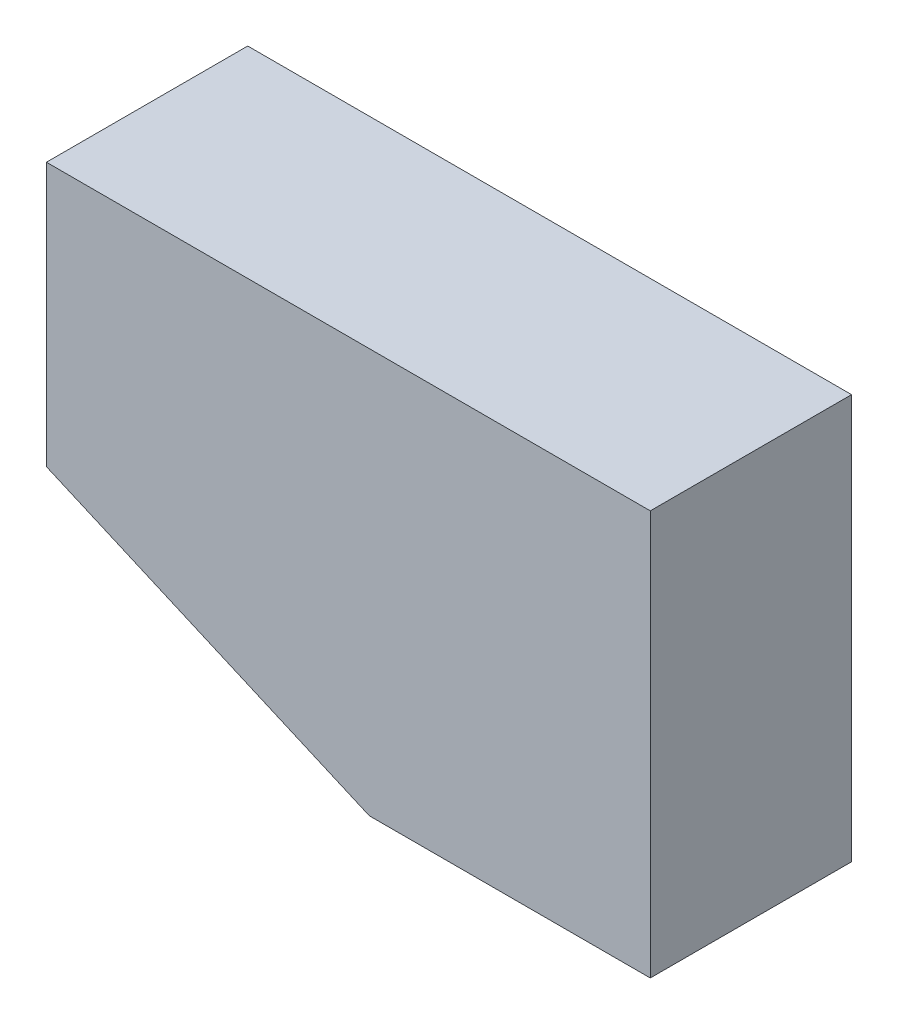
ISO-10303-21;
HEADER;
FILE_DESCRIPTION(('STEP AP214'),'2;1');
FILE_NAME('part.step','',(''),(''),'','','');
FILE_SCHEMA(('AUTOMOTIVE_DESIGN { 1 0 10303 214 1 1 1 1 }'));
ENDSEC;
DATA;
#1=APPLICATION_CONTEXT('core data for automotive mechanical design processes');
#2=APPLICATION_PROTOCOL_DEFINITION('international standard','automotive_design',2000,#1);
#3=PRODUCT_CONTEXT('',#1,'mechanical');
#4=PRODUCT('Part','Part','',(#3));
#5=PRODUCT_RELATED_PRODUCT_CATEGORY('part','',(#4));
#6=PRODUCT_DEFINITION_FORMATION('','',#4);
#7=PRODUCT_DEFINITION_CONTEXT('part definition',#1,'design');
#8=PRODUCT_DEFINITION('design','',#6,#7);
#9=PRODUCT_DEFINITION_SHAPE('','',#8);
#10=(LENGTH_UNIT() NAMED_UNIT(*) SI_UNIT(.MILLI.,.METRE.));
#11=(NAMED_UNIT(*) PLANE_ANGLE_UNIT() SI_UNIT($,.RADIAN.));
#12=(NAMED_UNIT(*) SI_UNIT($,.STERADIAN.) SOLID_ANGLE_UNIT());
#13=UNCERTAINTY_MEASURE_WITH_UNIT(LENGTH_MEASURE(1.E-05),#10,'distance_accuracy_value','');
#14=(GEOMETRIC_REPRESENTATION_CONTEXT(3) GLOBAL_UNCERTAINTY_ASSIGNED_CONTEXT((#13)) GLOBAL_UNIT_ASSIGNED_CONTEXT((#10,
#11,#12)) REPRESENTATION_CONTEXT('',''));
#15=CARTESIAN_POINT('',(0.,0.,0.));
#16=DIRECTION('',(0.,0.,1.));
#17=DIRECTION('',(1.,0.,0.));
#18=AXIS2_PLACEMENT_3D('',#15,#16,#17);
#19=CARTESIAN_POINT('',(9.15303283249891,193.333333333333,200.));
#20=DIRECTION('',(1.,0.,0.));
#21=DIRECTION('',(0.,1.,0.));
#22=AXIS2_PLACEMENT_3D('',#19,#20,#21);
#23=PLANE('',#22);
#24=DIRECTION('',(0.,-1.,0.));
#25=VECTOR('',#24,1.);
#26=CARTESIAN_POINT('',(9.15303283249891,193.333333333333,0.));
#27=LINE('',#26,#25);
#28=CARTESIAN_POINT('',(9.15303283249891,195.333333333333,0.));
#29=VERTEX_POINT('',#28);
#30=CARTESIAN_POINT('',(9.15303283249894,-66.6666666666667,0.));
#31=VERTEX_POINT('',#30);
#32=EDGE_CURVE('E150',#29,#31,#27,.T.);
#33=ORIENTED_EDGE('',*,*,#32,.T.);
#34=DIRECTION('',(0.,0.,-1.));
#35=VECTOR('',#34,1.);
#36=CARTESIAN_POINT('',(9.15303283249894,-66.6666666666667,200.));
#37=LINE('',#36,#35);
#38=CARTESIAN_POINT('',(9.15303283249894,-66.6666666666667,200.));
#39=VERTEX_POINT('',#38);
#40=EDGE_CURVE('E11',#39,#31,#37,.T.);
#41=ORIENTED_EDGE('',*,*,#40,.F.);
#42=DIRECTION('',(0.,-1.,0.));
#43=VECTOR('',#42,1.);
#44=CARTESIAN_POINT('',(9.15303283249891,193.333333333333,200.));
#45=LINE('',#44,#43);
#46=CARTESIAN_POINT('',(9.15303283249891,195.333333333333,200.));
#47=VERTEX_POINT('',#46);
#48=EDGE_CURVE('E118',#47,#39,#45,.T.);
#49=ORIENTED_EDGE('',*,*,#48,.F.);
#50=DIRECTION('',(0.,0.,1.));
#51=VECTOR('',#50,1.);
#52=CARTESIAN_POINT('',(9.15303283249891,195.333333333333,0.));
#53=LINE('',#52,#51);
#54=EDGE_CURVE('E122',#29,#47,#53,.T.);
#55=ORIENTED_EDGE('',*,*,#54,.F.);
#56=EDGE_LOOP('',(#33,#41,#49,#55));
#57=FACE_BOUND('',#56,.T.);
#58=ADVANCED_FACE('F35',(#57),#23,.F.);
#59=CARTESIAN_POINT('',(9.15303283249894,-66.6666666666667,200.));
#60=DIRECTION('',(0.4,0.916515138991168,0.));
#61=DIRECTION('',(-0.916515138991168,0.4,0.));
#62=AXIS2_PLACEMENT_3D('',#59,#60,#61);
#63=PLANE('',#62);
#64=DIRECTION('',(0.916515138991168,-0.4,0.));
#65=VECTOR('',#64,1.);
#66=CARTESIAN_POINT('',(9.15303283249894,-66.6666666666667,0.));
#67=LINE('',#66,#65);
#68=CARTESIAN_POINT('',(329.933331479408,-206.666666666667,0.));
#69=VERTEX_POINT('',#68);
#70=EDGE_CURVE('E65',#31,#69,#67,.T.);
#71=ORIENTED_EDGE('',*,*,#70,.T.);
#72=DIRECTION('',(0.,0.,-1.));
#73=VECTOR('',#72,1.);
#74=CARTESIAN_POINT('',(329.933331479408,-206.666666666667,200.));
#75=LINE('',#74,#73);
#76=CARTESIAN_POINT('',(329.933331479408,-206.666666666667,200.));
#77=VERTEX_POINT('',#76);
#78=EDGE_CURVE('E44',#77,#69,#75,.T.);
#79=ORIENTED_EDGE('',*,*,#78,.F.);
#80=DIRECTION('',(0.916515138991168,-0.4,0.));
#81=VECTOR('',#80,1.);
#82=CARTESIAN_POINT('',(9.15303283249894,-66.6666666666667,200.));
#83=LINE('',#82,#81);
#84=EDGE_CURVE('E73',#39,#77,#83,.T.);
#85=ORIENTED_EDGE('',*,*,#84,.F.);
#86=ORIENTED_EDGE('',*,*,#40,.T.);
#87=EDGE_LOOP('',(#71,#79,#85,#86));
#88=FACE_BOUND('',#87,.T.);
#89=ADVANCED_FACE('F204',(#88),#63,.F.);
#90=CARTESIAN_POINT('',(329.933331479408,-206.666666666667,200.));
#91=DIRECTION('',(0.,1.,0.));
#92=DIRECTION('',(0.,0.,1.));
#93=AXIS2_PLACEMENT_3D('',#90,#91,#92);
#94=PLANE('',#93);
#95=DIRECTION('',(1.,0.,0.));
#96=VECTOR('',#95,1.);
#97=CARTESIAN_POINT('',(329.933331479408,-206.666666666667,0.));
#98=LINE('',#97,#96);
#99=CARTESIAN_POINT('',(609.153032832499,-206.666666666667,0.));
#100=VERTEX_POINT('',#99);
#101=EDGE_CURVE('E70',#69,#100,#98,.T.);
#102=ORIENTED_EDGE('',*,*,#101,.T.);
#103=DIRECTION('',(0.,0.,-1.));
#104=VECTOR('',#103,1.);
#105=CARTESIAN_POINT('',(609.153032832499,-206.666666666667,200.));
#106=LINE('',#105,#104);
#107=CARTESIAN_POINT('',(609.153032832499,-206.666666666667,200.));
#108=VERTEX_POINT('',#107);
#109=EDGE_CURVE('E186',#108,#100,#106,.T.);
#110=ORIENTED_EDGE('',*,*,#109,.F.);
#111=DIRECTION('',(1.,0.,0.));
#112=VECTOR('',#111,1.);
#113=CARTESIAN_POINT('',(329.933331479408,-206.666666666667,200.));
#114=LINE('',#113,#112);
#115=EDGE_CURVE('E52',#77,#108,#114,.T.);
#116=ORIENTED_EDGE('',*,*,#115,.F.);
#117=ORIENTED_EDGE('',*,*,#78,.T.);
#118=EDGE_LOOP('',(#102,#110,#116,#117));
#119=FACE_BOUND('',#118,.T.);
#120=ADVANCED_FACE('F191',(#119),#94,.F.);
#121=CARTESIAN_POINT('',(609.153032832499,193.333333333333,200.));
#122=DIRECTION('',(-1.,0.,0.));
#123=DIRECTION('',(0.,0.,1.));
#124=AXIS2_PLACEMENT_3D('',#121,#122,#123);
#125=PLANE('',#124);
#126=DIRECTION('',(0.,1.,0.));
#127=VECTOR('',#126,1.);
#128=CARTESIAN_POINT('',(609.153032832499,193.333333333333,0.));
#129=LINE('',#128,#127);
#130=CARTESIAN_POINT('',(609.153032832499,195.333333333333,0.));
#131=VERTEX_POINT('',#130);
#132=EDGE_CURVE('E123',#100,#131,#129,.T.);
#133=ORIENTED_EDGE('',*,*,#132,.T.);
#134=DIRECTION('',(0.,0.,-1.));
#135=VECTOR('',#134,1.);
#136=CARTESIAN_POINT('',(609.153032832499,195.333333333333,0.));
#137=LINE('',#136,#135);
#138=CARTESIAN_POINT('',(609.153032832499,195.333333333333,200.));
#139=VERTEX_POINT('',#138);
#140=EDGE_CURVE('E133',#139,#131,#137,.T.);
#141=ORIENTED_EDGE('',*,*,#140,.F.);
#142=DIRECTION('',(0.,1.,0.));
#143=VECTOR('',#142,1.);
#144=CARTESIAN_POINT('',(609.153032832499,193.333333333333,200.));
#145=LINE('',#144,#143);
#146=EDGE_CURVE('E129',#108,#139,#145,.T.);
#147=ORIENTED_EDGE('',*,*,#146,.F.);
#148=ORIENTED_EDGE('',*,*,#109,.T.);
#149=EDGE_LOOP('',(#133,#141,#147,#148));
#150=FACE_BOUND('',#149,.T.);
#151=ADVANCED_FACE('F196',(#150),#125,.F.);
#152=CARTESIAN_POINT('',(0.,0.,200.));
#153=DIRECTION('',(0.,0.,1.));
#154=DIRECTION('',(1.,0.,0.));
#155=AXIS2_PLACEMENT_3D('',#152,#153,#154);
#156=PLANE('',#155);
#157=ORIENTED_EDGE('',*,*,#48,.T.);
#158=ORIENTED_EDGE('',*,*,#84,.T.);
#159=ORIENTED_EDGE('',*,*,#115,.T.);
#160=ORIENTED_EDGE('',*,*,#146,.T.);
#161=DIRECTION('',(1.,0.,0.));
#162=VECTOR('',#161,1.);
#163=CARTESIAN_POINT('',(9.15303283249891,195.333333333333,200.));
#164=LINE('',#163,#162);
#165=EDGE_CURVE('E126',#47,#139,#164,.T.);
#166=ORIENTED_EDGE('',*,*,#165,.F.);
#167=EDGE_LOOP('',(#157,#158,#159,#160,#166));
#168=FACE_BOUND('',#167,.T.);
#169=ADVANCED_FACE('F127',(#168),#156,.T.);
#170=CARTESIAN_POINT('',(0.,0.,0.));
#171=DIRECTION('',(0.,0.,1.));
#172=DIRECTION('',(1.,0.,0.));
#173=AXIS2_PLACEMENT_3D('',#170,#171,#172);
#174=PLANE('',#173);
#175=ORIENTED_EDGE('',*,*,#32,.F.);
#176=DIRECTION('',(-1.,0.,0.));
#177=VECTOR('',#176,1.);
#178=CARTESIAN_POINT('',(9.15303283249891,195.333333333333,0.));
#179=LINE('',#178,#177);
#180=EDGE_CURVE('E138',#131,#29,#179,.T.);
#181=ORIENTED_EDGE('',*,*,#180,.F.);
#182=ORIENTED_EDGE('',*,*,#132,.F.);
#183=ORIENTED_EDGE('',*,*,#101,.F.);
#184=ORIENTED_EDGE('',*,*,#70,.F.);
#185=EDGE_LOOP('',(#175,#181,#182,#183,#184));
#186=FACE_BOUND('',#185,.T.);
#187=ADVANCED_FACE('F194',(#186),#174,.F.);
#188=CARTESIAN_POINT('',(0.,195.333333333333,0.));
#189=DIRECTION('',(0.,1.,0.));
#190=DIRECTION('',(0.,0.,1.));
#191=AXIS2_PLACEMENT_3D('',#188,#189,#190);
#192=PLANE('',#191);
#193=ORIENTED_EDGE('',*,*,#54,.T.);
#194=ORIENTED_EDGE('',*,*,#165,.T.);
#195=ORIENTED_EDGE('',*,*,#140,.T.);
#196=ORIENTED_EDGE('',*,*,#180,.T.);
#197=EDGE_LOOP('',(#193,#194,#195,#196));
#198=FACE_BOUND('',#197,.T.);
#199=ADVANCED_FACE('F136',(#198),#192,.T.);
#200=CLOSED_SHELL('',(#58,#89,#120,#151,#169,#187,#199));
#201=CARTESIAN_POINT('',(329.933331479408,-200.666666666667,200.));
#202=DIRECTION('',(0.,1.,0.));
#203=DIRECTION('',(0.,0.,1.));
#204=AXIS2_PLACEMENT_3D('',#201,#202,#203);
#205=PLANE('',#204);
#206=DIRECTION('',(1.,0.,0.));
#207=VECTOR('',#206,1.);
#208=CARTESIAN_POINT('',(329.933331479408,-200.666666666667,6.00000000000001));
#209=LINE('',#208,#207);
#210=CARTESIAN_POINT('',(331.18560439454,-200.666666666667,6.));
#211=VERTEX_POINT('',#210);
#212=CARTESIAN_POINT('',(603.153032832499,-200.666666666667,6.));
#213=VERTEX_POINT('',#212);
#214=EDGE_CURVE('E158',#211,#213,#209,.T.);
#215=ORIENTED_EDGE('',*,*,#214,.F.);
#216=DIRECTION('',(0.,0.,-1.));
#217=VECTOR('',#216,1.);
#218=CARTESIAN_POINT('',(331.18560439454,-200.666666666667,200.));
#219=LINE('',#218,#217);
#220=CARTESIAN_POINT('',(331.18560439454,-200.666666666667,194.));
#221=VERTEX_POINT('',#220);
#222=EDGE_CURVE('E151',#221,#211,#219,.T.);
#223=ORIENTED_EDGE('',*,*,#222,.F.);
#224=DIRECTION('',(1.,0.,0.));
#225=VECTOR('',#224,1.);
#226=CARTESIAN_POINT('',(329.933331479408,-200.666666666667,194.));
#227=LINE('',#226,#225);
#228=CARTESIAN_POINT('',(603.153032832499,-200.666666666667,194.));
#229=VERTEX_POINT('',#228);
#230=EDGE_CURVE('E163',#221,#229,#227,.T.);
#231=ORIENTED_EDGE('',*,*,#230,.T.);
#232=DIRECTION('',(0.,0.,-1.));
#233=VECTOR('',#232,1.);
#234=CARTESIAN_POINT('',(603.153032832499,-200.666666666667,200.));
#235=LINE('',#234,#233);
#236=EDGE_CURVE('E161',#229,#213,#235,.T.);
#237=ORIENTED_EDGE('',*,*,#236,.T.);
#238=EDGE_LOOP('',(#215,#223,#231,#237));
#239=FACE_BOUND('',#238,.T.);
#240=ADVANCED_FACE('F229',(#239),#205,.T.);
#241=CARTESIAN_POINT('',(11.5530328324989,-61.1675758327196,200.));
#242=DIRECTION('',(0.4,0.916515138991168,0.));
#243=DIRECTION('',(-0.916515138991168,0.4,0.));
#244=AXIS2_PLACEMENT_3D('',#241,#242,#243);
#245=PLANE('',#244);
#246=DIRECTION('',(0.916515138991168,-0.4,0.));
#247=VECTOR('',#246,1.);
#248=CARTESIAN_POINT('',(11.5530328324989,-61.1675758327196,6.00000000000001));
#249=LINE('',#248,#247);
#250=CARTESIAN_POINT('',(15.1530328324989,-62.7387446424188,6.));
#251=VERTEX_POINT('',#250);
#252=EDGE_CURVE('E146',#251,#211,#249,.T.);
#253=ORIENTED_EDGE('',*,*,#252,.F.);
#254=DIRECTION('',(0.,0.,-1.));
#255=VECTOR('',#254,1.);
#256=CARTESIAN_POINT('',(15.1530328324989,-62.7387446424188,200.));
#257=LINE('',#256,#255);
#258=CARTESIAN_POINT('',(15.1530328324989,-62.7387446424188,194.));
#259=VERTEX_POINT('',#258);
#260=EDGE_CURVE('E147',#259,#251,#257,.T.);
#261=ORIENTED_EDGE('',*,*,#260,.F.);
#262=DIRECTION('',(0.916515138991168,-0.4,0.));
#263=VECTOR('',#262,1.);
#264=CARTESIAN_POINT('',(11.5530328324989,-61.1675758327196,194.));
#265=LINE('',#264,#263);
#266=EDGE_CURVE('E155',#259,#221,#265,.T.);
#267=ORIENTED_EDGE('',*,*,#266,.T.);
#268=ORIENTED_EDGE('',*,*,#222,.T.);
#269=EDGE_LOOP('',(#253,#261,#267,#268));
#270=FACE_BOUND('',#269,.T.);
#271=ADVANCED_FACE('F223',(#270),#245,.T.);
#272=CARTESIAN_POINT('',(0.,0.,194.));
#273=DIRECTION('',(0.,0.,1.));
#274=DIRECTION('',(1.,0.,0.));
#275=AXIS2_PLACEMENT_3D('',#272,#273,#274);
#276=PLANE('',#275);
#277=DIRECTION('',(0.,-1.,0.));
#278=VECTOR('',#277,1.);
#279=CARTESIAN_POINT('',(15.1530328324989,193.333333333333,194.));
#280=LINE('',#279,#278);
#281=CARTESIAN_POINT('',(15.1530328324989,193.333333333333,194.));
#282=VERTEX_POINT('',#281);
#283=EDGE_CURVE('E152',#282,#259,#280,.T.);
#284=ORIENTED_EDGE('',*,*,#283,.F.);
#285=DIRECTION('',(-1.,0.,0.));
#286=VECTOR('',#285,1.);
#287=CARTESIAN_POINT('',(9.15303283249891,193.333333333333,194.));
#288=LINE('',#287,#286);
#289=CARTESIAN_POINT('',(603.153032832499,193.333333333333,194.));
#290=VERTEX_POINT('',#289);
#291=EDGE_CURVE('E175',#290,#282,#288,.T.);
#292=ORIENTED_EDGE('',*,*,#291,.F.);
#293=DIRECTION('',(0.,1.,0.));
#294=VECTOR('',#293,1.);
#295=CARTESIAN_POINT('',(603.153032832499,193.333333333333,194.));
#296=LINE('',#295,#294);
#297=EDGE_CURVE('E170',#229,#290,#296,.T.);
#298=ORIENTED_EDGE('',*,*,#297,.F.);
#299=ORIENTED_EDGE('',*,*,#230,.F.);
#300=ORIENTED_EDGE('',*,*,#266,.F.);
#301=EDGE_LOOP('',(#284,#292,#298,#299,#300));
#302=FACE_BOUND('',#301,.T.);
#303=ADVANCED_FACE('F228',(#302),#276,.F.);
#304=CARTESIAN_POINT('',(0.,0.,6.));
#305=DIRECTION('',(0.,0.,1.));
#306=DIRECTION('',(1.,0.,0.));
#307=AXIS2_PLACEMENT_3D('',#304,#305,#306);
#308=PLANE('',#307);
#309=DIRECTION('',(0.,-1.,0.));
#310=VECTOR('',#309,1.);
#311=CARTESIAN_POINT('',(15.1530328324989,193.333333333333,6.00000000000001));
#312=LINE('',#311,#310);
#313=CARTESIAN_POINT('',(15.1530328324989,193.333333333333,6.));
#314=VERTEX_POINT('',#313);
#315=EDGE_CURVE('E143',#314,#251,#312,.T.);
#316=ORIENTED_EDGE('',*,*,#315,.T.);
#317=ORIENTED_EDGE('',*,*,#252,.T.);
#318=ORIENTED_EDGE('',*,*,#214,.T.);
#319=DIRECTION('',(0.,1.,0.));
#320=VECTOR('',#319,1.);
#321=CARTESIAN_POINT('',(603.153032832499,193.333333333333,6.00000000000001));
#322=LINE('',#321,#320);
#323=CARTESIAN_POINT('',(603.153032832499,193.333333333333,6.));
#324=VERTEX_POINT('',#323);
#325=EDGE_CURVE('E165',#213,#324,#322,.T.);
#326=ORIENTED_EDGE('',*,*,#325,.T.);
#327=DIRECTION('',(-1.,0.,0.));
#328=VECTOR('',#327,1.);
#329=CARTESIAN_POINT('',(9.15303283249891,193.333333333333,6.00000000000001));
#330=LINE('',#329,#328);
#331=EDGE_CURVE('E156',#324,#314,#330,.T.);
#332=ORIENTED_EDGE('',*,*,#331,.T.);
#333=EDGE_LOOP('',(#316,#317,#318,#326,#332));
#334=FACE_BOUND('',#333,.T.);
#335=ADVANCED_FACE('F285',(#334),#308,.T.);
#336=CARTESIAN_POINT('',(603.153032832499,193.333333333333,200.));
#337=DIRECTION('',(-1.,0.,0.));
#338=DIRECTION('',(0.,0.,1.));
#339=AXIS2_PLACEMENT_3D('',#336,#337,#338);
#340=PLANE('',#339);
#341=ORIENTED_EDGE('',*,*,#325,.F.);
#342=ORIENTED_EDGE('',*,*,#236,.F.);
#343=ORIENTED_EDGE('',*,*,#297,.T.);
#344=DIRECTION('',(0.,0.,-1.));
#345=VECTOR('',#344,1.);
#346=CARTESIAN_POINT('',(603.153032832499,193.333333333333,200.));
#347=LINE('',#346,#345);
#348=EDGE_CURVE('E168',#290,#324,#347,.T.);
#349=ORIENTED_EDGE('',*,*,#348,.T.);
#350=EDGE_LOOP('',(#341,#342,#343,#349));
#351=FACE_BOUND('',#350,.T.);
#352=ADVANCED_FACE('F294',(#351),#340,.T.);
#353=CARTESIAN_POINT('',(15.1530328324989,193.333333333333,200.));
#354=DIRECTION('',(1.,0.,0.));
#355=DIRECTION('',(0.,1.,0.));
#356=AXIS2_PLACEMENT_3D('',#353,#354,#355);
#357=PLANE('',#356);
#358=ORIENTED_EDGE('',*,*,#315,.F.);
#359=DIRECTION('',(0.,0.,-1.));
#360=VECTOR('',#359,1.);
#361=CARTESIAN_POINT('',(15.1530328324989,193.333333333333,200.));
#362=LINE('',#361,#360);
#363=EDGE_CURVE('E176',#282,#314,#362,.T.);
#364=ORIENTED_EDGE('',*,*,#363,.F.);
#365=ORIENTED_EDGE('',*,*,#283,.T.);
#366=ORIENTED_EDGE('',*,*,#260,.T.);
#367=EDGE_LOOP('',(#358,#364,#365,#366));
#368=FACE_BOUND('',#367,.T.);
#369=ADVANCED_FACE('F303',(#368),#357,.T.);
#370=CARTESIAN_POINT('',(0.,193.333333333333,0.));
#371=DIRECTION('',(0.,1.,0.));
#372=DIRECTION('',(0.,0.,1.));
#373=AXIS2_PLACEMENT_3D('',#370,#371,#372);
#374=PLANE('',#373);
#375=ORIENTED_EDGE('',*,*,#348,.F.);
#376=ORIENTED_EDGE('',*,*,#291,.T.);
#377=ORIENTED_EDGE('',*,*,#363,.T.);
#378=ORIENTED_EDGE('',*,*,#331,.F.);
#379=EDGE_LOOP('',(#375,#376,#377,#378));
#380=FACE_BOUND('',#379,.T.);
#381=ADVANCED_FACE('F312',(#380),#374,.F.);
#382=CLOSED_SHELL('',(#240,#271,#303,#335,#352,#369,#381));
#383=ORIENTED_CLOSED_SHELL('',*,#382,.T.);
#384=BREP_WITH_VOIDS('B2',#200,(#383));
#385=ADVANCED_BREP_SHAPE_REPRESENTATION('',(#18,#384),#14);
#386=SHAPE_DEFINITION_REPRESENTATION(#9,#385);
ENDSEC;
END-ISO-10303-21;
